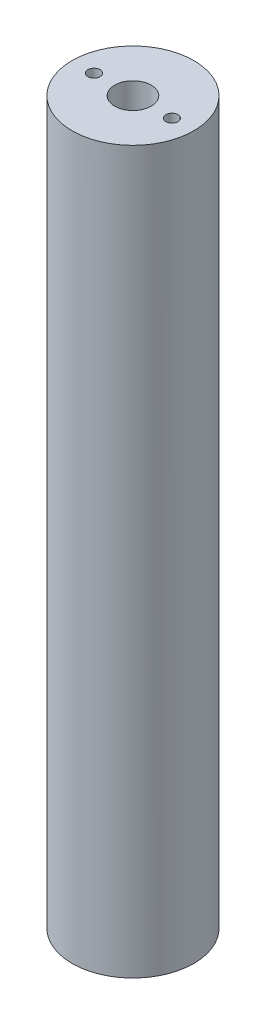
ISO-10303-21;
HEADER;
FILE_DESCRIPTION(('STEP AP214'),'2;1');
FILE_NAME('part.step','',(''),(''),'','','');
FILE_SCHEMA(('AUTOMOTIVE_DESIGN { 1 0 10303 214 1 1 1 1 }'));
ENDSEC;
DATA;
#1=APPLICATION_CONTEXT('core data for automotive mechanical design processes');
#2=APPLICATION_PROTOCOL_DEFINITION('international standard','automotive_design',2000,#1);
#3=PRODUCT_CONTEXT('',#1,'mechanical');
#4=PRODUCT('Part','Part','',(#3));
#5=PRODUCT_RELATED_PRODUCT_CATEGORY('part','',(#4));
#6=PRODUCT_DEFINITION_FORMATION('','',#4);
#7=PRODUCT_DEFINITION_CONTEXT('part definition',#1,'design');
#8=PRODUCT_DEFINITION('design','',#6,#7);
#9=PRODUCT_DEFINITION_SHAPE('','',#8);
#10=(LENGTH_UNIT() NAMED_UNIT(*) SI_UNIT(.MILLI.,.METRE.));
#11=(NAMED_UNIT(*) PLANE_ANGLE_UNIT() SI_UNIT($,.RADIAN.));
#12=(NAMED_UNIT(*) SI_UNIT($,.STERADIAN.) SOLID_ANGLE_UNIT());
#13=UNCERTAINTY_MEASURE_WITH_UNIT(LENGTH_MEASURE(1.E-05),#10,'distance_accuracy_value','');
#14=(GEOMETRIC_REPRESENTATION_CONTEXT(3) GLOBAL_UNCERTAINTY_ASSIGNED_CONTEXT((#13)) GLOBAL_UNIT_ASSIGNED_CONTEXT((#10,
#11,#12)) REPRESENTATION_CONTEXT('',''));
#15=CARTESIAN_POINT('',(0.,0.,0.));
#16=DIRECTION('',(0.,0.,1.));
#17=DIRECTION('',(1.,0.,0.));
#18=AXIS2_PLACEMENT_3D('',#15,#16,#17);
#19=CARTESIAN_POINT('',(180.83032118404,106.331995431757,0.));
#20=DIRECTION('',(0.,1.,0.));
#21=DIRECTION('',(-1.,0.,0.));
#22=AXIS2_PLACEMENT_3D('',#19,#20,#21);
#23=CYLINDRICAL_SURFACE('',#22,4.76250000000001);
#24=CARTESIAN_POINT('',(180.83032118404,309.531995431757,0.));
#25=DIRECTION('',(0.,1.,0.));
#26=DIRECTION('',(-1.,0.,0.));
#27=AXIS2_PLACEMENT_3D('',#24,#25,#26);
#28=CIRCLE('',#27,4.76250000000001);
#29=CARTESIAN_POINT('',(176.06782118404,309.531995431757,0.));
#30=VERTEX_POINT('',#29);
#31=EDGE_CURVE('E39',#30,#30,#28,.T.);
#32=ORIENTED_EDGE('',*,*,#31,.T.);
#33=EDGE_LOOP('',(#32));
#34=FACE_BOUND('',#33,.T.);
#35=CARTESIAN_POINT('',(180.83032118404,121.463536967766,0.));
#36=DIRECTION('',(0.,-1.,0.));
#37=DIRECTION('',(1.,0.,0.));
#38=AXIS2_PLACEMENT_3D('',#35,#36,#37);
#39=CIRCLE('',#38,4.76250000000001);
#40=CARTESIAN_POINT('',(185.59282118404,121.463536967766,0.));
#41=VERTEX_POINT('',#40);
#42=EDGE_CURVE('E35',#41,#41,#39,.F.);
#43=ORIENTED_EDGE('',*,*,#42,.F.);
#44=EDGE_LOOP('',(#43));
#45=FACE_BOUND('',#44,.T.);
#46=ADVANCED_FACE('F31',(#34,#45),#23,.F.);
#47=CARTESIAN_POINT('',(164.95532118404,309.531995431757,0.));
#48=DIRECTION('',(0.,1.,0.));
#49=DIRECTION('',(-1.,0.,0.));
#50=AXIS2_PLACEMENT_3D('',#47,#48,#49);
#51=PLANE('',#50);
#52=CARTESIAN_POINT('',(190.99032118404,309.531995431757,0.));
#53=DIRECTION('',(0.,1.,0.));
#54=DIRECTION('',(-1.,0.,0.));
#55=AXIS2_PLACEMENT_3D('',#52,#53,#54);
#56=CIRCLE('',#55,1.58749999999999);
#57=CARTESIAN_POINT('',(189.40282118404,309.531995431757,0.));
#58=VERTEX_POINT('',#57);
#59=EDGE_CURVE('E55',#58,#58,#56,.T.);
#60=ORIENTED_EDGE('',*,*,#59,.F.);
#61=EDGE_LOOP('',(#60));
#62=FACE_BOUND('',#61,.T.);
#63=CARTESIAN_POINT('',(170.67032118404,309.531995431757,0.));
#64=DIRECTION('',(0.,1.,0.));
#65=DIRECTION('',(-1.,0.,0.));
#66=AXIS2_PLACEMENT_3D('',#63,#64,#65);
#67=CIRCLE('',#66,1.58749999999999);
#68=CARTESIAN_POINT('',(169.08282118404,309.531995431757,0.));
#69=VERTEX_POINT('',#68);
#70=EDGE_CURVE('E48',#69,#69,#67,.T.);
#71=ORIENTED_EDGE('',*,*,#70,.F.);
#72=EDGE_LOOP('',(#71));
#73=FACE_BOUND('',#72,.T.);
#74=ORIENTED_EDGE('',*,*,#31,.F.);
#75=EDGE_LOOP('',(#74));
#76=FACE_BOUND('',#75,.T.);
#77=CARTESIAN_POINT('',(180.83032118404,309.531995431757,0.));
#78=DIRECTION('',(0.,1.,0.));
#79=DIRECTION('',(-1.,0.,0.));
#80=AXIS2_PLACEMENT_3D('',#77,#78,#79);
#81=CIRCLE('',#80,15.875);
#82=CARTESIAN_POINT('',(164.95532118404,309.531995431757,0.));
#83=VERTEX_POINT('',#82);
#84=EDGE_CURVE('E10',#83,#83,#81,.T.);
#85=ORIENTED_EDGE('',*,*,#84,.T.);
#86=EDGE_LOOP('',(#85));
#87=FACE_BOUND('',#86,.T.);
#88=ADVANCED_FACE('F33',(#62,#73,#76,#87),#51,.T.);
#89=CARTESIAN_POINT('',(180.83032118404,309.531995431757,0.));
#90=DIRECTION('',(0.,1.,0.));
#91=DIRECTION('',(-1.,0.,0.));
#92=AXIS2_PLACEMENT_3D('',#89,#90,#91);
#93=CYLINDRICAL_SURFACE('',#92,15.875);
#94=CARTESIAN_POINT('',(180.83032118404,121.463536967766,0.));
#95=DIRECTION('',(0.,-1.,0.));
#96=DIRECTION('',(1.,0.,0.));
#97=AXIS2_PLACEMENT_3D('',#94,#95,#96);
#98=CIRCLE('',#97,15.875);
#99=CARTESIAN_POINT('',(196.70532118404,121.463536967766,0.));
#100=VERTEX_POINT('',#99);
#101=EDGE_CURVE('E43',#100,#100,#98,.F.);
#102=ORIENTED_EDGE('',*,*,#101,.T.);
#103=EDGE_LOOP('',(#102));
#104=FACE_BOUND('',#103,.T.);
#105=ORIENTED_EDGE('',*,*,#84,.F.);
#106=EDGE_LOOP('',(#105));
#107=FACE_BOUND('',#106,.T.);
#108=ADVANCED_FACE('F86',(#104,#107),#93,.T.);
#109=CARTESIAN_POINT('',(136.678676760816,121.463536967766,-26.13565879533));
#110=DIRECTION('',(0.,-1.,0.));
#111=DIRECTION('',(1.,0.,0.));
#112=AXIS2_PLACEMENT_3D('',#109,#110,#111);
#113=PLANE('',#112);
#114=CARTESIAN_POINT('',(190.99032118404,121.463536967766,0.));
#115=DIRECTION('',(0.,-1.,0.));
#116=DIRECTION('',(1.,0.,0.));
#117=AXIS2_PLACEMENT_3D('',#114,#115,#116);
#118=CIRCLE('',#117,1.58749999999999);
#119=CARTESIAN_POINT('',(192.57782118404,121.463536967766,0.));
#120=VERTEX_POINT('',#119);
#121=EDGE_CURVE('E67',#120,#120,#118,.T.);
#122=ORIENTED_EDGE('',*,*,#121,.F.);
#123=EDGE_LOOP('',(#122));
#124=FACE_BOUND('',#123,.T.);
#125=CARTESIAN_POINT('',(170.67032118404,121.463536967766,0.));
#126=DIRECTION('',(0.,-1.,0.));
#127=DIRECTION('',(1.,0.,0.));
#128=AXIS2_PLACEMENT_3D('',#125,#126,#127);
#129=CIRCLE('',#128,1.58749999999999);
#130=CARTESIAN_POINT('',(172.25782118404,121.463536967766,0.));
#131=VERTEX_POINT('',#130);
#132=EDGE_CURVE('E61',#131,#131,#129,.T.);
#133=ORIENTED_EDGE('',*,*,#132,.F.);
#134=EDGE_LOOP('',(#133));
#135=FACE_BOUND('',#134,.T.);
#136=ORIENTED_EDGE('',*,*,#101,.F.);
#137=EDGE_LOOP('',(#136));
#138=FACE_BOUND('',#137,.T.);
#139=ORIENTED_EDGE('',*,*,#42,.T.);
#140=EDGE_LOOP('',(#139));
#141=FACE_BOUND('',#140,.T.);
#142=ADVANCED_FACE('F82',(#124,#135,#138,#141),#113,.T.);
#143=CARTESIAN_POINT('',(170.67032118404,296.831995431757,0.));
#144=DIRECTION('',(0.,1.,0.));
#145=DIRECTION('',(-1.,0.,0.));
#146=AXIS2_PLACEMENT_3D('',#143,#144,#145);
#147=CYLINDRICAL_SURFACE('',#146,1.58749999999999);
#148=CARTESIAN_POINT('',(170.67032118404,296.831995431757,0.));
#149=DIRECTION('',(0.,1.,0.));
#150=DIRECTION('',(-1.,0.,0.));
#151=AXIS2_PLACEMENT_3D('',#148,#149,#150);
#152=CIRCLE('',#151,1.58749999999999);
#153=CARTESIAN_POINT('',(169.08282118404,296.831995431757,0.));
#154=VERTEX_POINT('',#153);
#155=EDGE_CURVE('E51',#154,#154,#152,.T.);
#156=ORIENTED_EDGE('',*,*,#155,.F.);
#157=EDGE_LOOP('',(#156));
#158=FACE_BOUND('',#157,.T.);
#159=ORIENTED_EDGE('',*,*,#70,.T.);
#160=EDGE_LOOP('',(#159));
#161=FACE_BOUND('',#160,.T.);
#162=ADVANCED_FACE('F85',(#158,#161),#147,.F.);
#163=CARTESIAN_POINT('',(170.67032118404,296.831995431757,0.));
#164=DIRECTION('',(0.,1.,0.));
#165=DIRECTION('',(-1.,0.,0.));
#166=AXIS2_PLACEMENT_3D('',#163,#164,#165);
#167=PLANE('',#166);
#168=ORIENTED_EDGE('',*,*,#155,.T.);
#169=EDGE_LOOP('',(#168));
#170=FACE_BOUND('',#169,.T.);
#171=ADVANCED_FACE('F127',(#170),#167,.T.);
#172=CARTESIAN_POINT('',(190.99032118404,296.831995431757,0.));
#173=DIRECTION('',(0.,1.,0.));
#174=DIRECTION('',(-1.,0.,0.));
#175=AXIS2_PLACEMENT_3D('',#172,#173,#174);
#176=CYLINDRICAL_SURFACE('',#175,1.58749999999999);
#177=CARTESIAN_POINT('',(190.99032118404,296.831995431757,0.));
#178=DIRECTION('',(0.,1.,0.));
#179=DIRECTION('',(-1.,0.,0.));
#180=AXIS2_PLACEMENT_3D('',#177,#178,#179);
#181=CIRCLE('',#180,1.58749999999999);
#182=CARTESIAN_POINT('',(189.40282118404,296.831995431757,0.));
#183=VERTEX_POINT('',#182);
#184=EDGE_CURVE('E52',#183,#183,#181,.T.);
#185=ORIENTED_EDGE('',*,*,#184,.F.);
#186=EDGE_LOOP('',(#185));
#187=FACE_BOUND('',#186,.T.);
#188=ORIENTED_EDGE('',*,*,#59,.T.);
#189=EDGE_LOOP('',(#188));
#190=FACE_BOUND('',#189,.T.);
#191=ADVANCED_FACE('F133',(#187,#190),#176,.F.);
#192=CARTESIAN_POINT('',(190.99032118404,296.831995431757,0.));
#193=DIRECTION('',(0.,1.,0.));
#194=DIRECTION('',(-1.,0.,0.));
#195=AXIS2_PLACEMENT_3D('',#192,#193,#194);
#196=PLANE('',#195);
#197=ORIENTED_EDGE('',*,*,#184,.T.);
#198=EDGE_LOOP('',(#197));
#199=FACE_BOUND('',#198,.T.);
#200=ADVANCED_FACE('F141',(#199),#196,.T.);
#201=CARTESIAN_POINT('',(170.67032118404,134.163536967766,0.));
#202=DIRECTION('',(0.,-1.,0.));
#203=DIRECTION('',(1.,0.,0.));
#204=AXIS2_PLACEMENT_3D('',#201,#202,#203);
#205=CYLINDRICAL_SURFACE('',#204,1.58749999999999);
#206=CARTESIAN_POINT('',(170.67032118404,134.163536967766,0.));
#207=DIRECTION('',(0.,-1.,0.));
#208=DIRECTION('',(1.,0.,0.));
#209=AXIS2_PLACEMENT_3D('',#206,#207,#208);
#210=CIRCLE('',#209,1.58749999999999);
#211=CARTESIAN_POINT('',(172.25782118404,134.163536967766,0.));
#212=VERTEX_POINT('',#211);
#213=EDGE_CURVE('E58',#212,#212,#210,.T.);
#214=ORIENTED_EDGE('',*,*,#213,.F.);
#215=EDGE_LOOP('',(#214));
#216=FACE_BOUND('',#215,.T.);
#217=ORIENTED_EDGE('',*,*,#132,.T.);
#218=EDGE_LOOP('',(#217));
#219=FACE_BOUND('',#218,.T.);
#220=ADVANCED_FACE('F148',(#216,#219),#205,.F.);
#221=CARTESIAN_POINT('',(170.67032118404,134.163536967766,0.));
#222=DIRECTION('',(0.,-1.,0.));
#223=DIRECTION('',(1.,0.,0.));
#224=AXIS2_PLACEMENT_3D('',#221,#222,#223);
#225=PLANE('',#224);
#226=ORIENTED_EDGE('',*,*,#213,.T.);
#227=EDGE_LOOP('',(#226));
#228=FACE_BOUND('',#227,.T.);
#229=ADVANCED_FACE('F78',(#228),#225,.T.);
#230=CARTESIAN_POINT('',(190.99032118404,134.163536967766,0.));
#231=DIRECTION('',(0.,-1.,0.));
#232=DIRECTION('',(1.,0.,0.));
#233=AXIS2_PLACEMENT_3D('',#230,#231,#232);
#234=CYLINDRICAL_SURFACE('',#233,1.58749999999999);
#235=CARTESIAN_POINT('',(190.99032118404,134.163536967766,0.));
#236=DIRECTION('',(0.,-1.,0.));
#237=DIRECTION('',(1.,0.,0.));
#238=AXIS2_PLACEMENT_3D('',#235,#236,#237);
#239=CIRCLE('',#238,1.58749999999999);
#240=CARTESIAN_POINT('',(192.57782118404,134.163536967766,0.));
#241=VERTEX_POINT('',#240);
#242=EDGE_CURVE('E64',#241,#241,#239,.T.);
#243=ORIENTED_EDGE('',*,*,#242,.F.);
#244=EDGE_LOOP('',(#243));
#245=FACE_BOUND('',#244,.T.);
#246=ORIENTED_EDGE('',*,*,#121,.T.);
#247=EDGE_LOOP('',(#246));
#248=FACE_BOUND('',#247,.T.);
#249=ADVANCED_FACE('F75',(#245,#248),#234,.F.);
#250=CARTESIAN_POINT('',(190.99032118404,134.163536967766,0.));
#251=DIRECTION('',(0.,-1.,0.));
#252=DIRECTION('',(1.,0.,0.));
#253=AXIS2_PLACEMENT_3D('',#250,#251,#252);
#254=PLANE('',#253);
#255=ORIENTED_EDGE('',*,*,#242,.T.);
#256=EDGE_LOOP('',(#255));
#257=FACE_BOUND('',#256,.T.);
#258=ADVANCED_FACE('F73',(#257),#254,.T.);
#259=CLOSED_SHELL('',(#46,#88,#108,#142,#162,#171,#191,#200,#220,#229,#249,#258));
#260=MANIFOLD_SOLID_BREP('B2',#259);
#261=ADVANCED_BREP_SHAPE_REPRESENTATION('',(#18,#260),#14);
#262=SHAPE_DEFINITION_REPRESENTATION(#9,#261);
ENDSEC;
END-ISO-10303-21;
